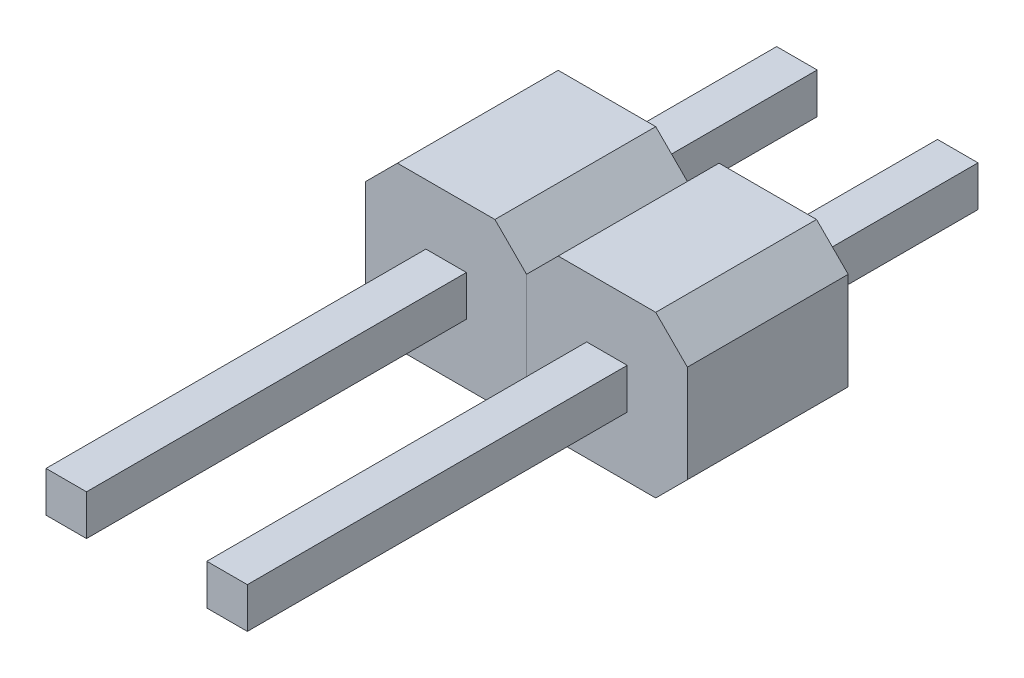
ISO-10303-21;
HEADER;
FILE_DESCRIPTION(('STEP AP214'),'2;1');
FILE_NAME('part.step','',(''),(''),'','','');
FILE_SCHEMA(('AUTOMOTIVE_DESIGN { 1 0 10303 214 1 1 1 1 }'));
ENDSEC;
DATA;
#1=APPLICATION_CONTEXT('core data for automotive mechanical design processes');
#2=APPLICATION_PROTOCOL_DEFINITION('international standard','automotive_design',2000,#1);
#3=PRODUCT_CONTEXT('',#1,'mechanical');
#4=PRODUCT('Part','Part','',(#3));
#5=PRODUCT_RELATED_PRODUCT_CATEGORY('part','',(#4));
#6=PRODUCT_DEFINITION_FORMATION('','',#4);
#7=PRODUCT_DEFINITION_CONTEXT('part definition',#1,'design');
#8=PRODUCT_DEFINITION('design','',#6,#7);
#9=PRODUCT_DEFINITION_SHAPE('','',#8);
#10=(LENGTH_UNIT() NAMED_UNIT(*) SI_UNIT(.MILLI.,.METRE.));
#11=(NAMED_UNIT(*) PLANE_ANGLE_UNIT() SI_UNIT($,.RADIAN.));
#12=(NAMED_UNIT(*) SI_UNIT($,.STERADIAN.) SOLID_ANGLE_UNIT());
#13=UNCERTAINTY_MEASURE_WITH_UNIT(LENGTH_MEASURE(1.E-05),#10,'distance_accuracy_value','');
#14=(GEOMETRIC_REPRESENTATION_CONTEXT(3) GLOBAL_UNCERTAINTY_ASSIGNED_CONTEXT((#13)) GLOBAL_UNIT_ASSIGNED_CONTEXT((#10,
#11,#12)) REPRESENTATION_CONTEXT('',''));
#15=CARTESIAN_POINT('',(0.,0.,0.));
#16=DIRECTION('',(0.,0.,1.));
#17=DIRECTION('',(1.,0.,0.));
#18=AXIS2_PLACEMENT_3D('',#15,#16,#17);
#19=CARTESIAN_POINT('',(-1.27,1.27,2.54));
#20=DIRECTION('',(0.,-1.,0.));
#21=DIRECTION('',(0.,0.,-1.));
#22=AXIS2_PLACEMENT_3D('',#19,#20,#21);
#23=PLANE('',#22);
#24=DIRECTION('',(-1.,0.,0.));
#25=VECTOR('',#24,1.);
#26=CARTESIAN_POINT('',(-1.27,1.27,2.54));
#27=LINE('',#26,#25);
#28=CARTESIAN_POINT('',(0.77,1.27,2.54));
#29=VERTEX_POINT('',#28);
#30=CARTESIAN_POINT('',(-0.77,1.27,2.54));
#31=VERTEX_POINT('',#30);
#32=EDGE_CURVE('P0_E124',#29,#31,#27,.T.);
#33=ORIENTED_EDGE('',*,*,#32,.F.);
#34=DIRECTION('',(0.,0.,-1.));
#35=VECTOR('',#34,1.);
#36=CARTESIAN_POINT('',(0.77,1.27,2.54));
#37=LINE('',#36,#35);
#38=CARTESIAN_POINT('',(0.77,1.27,0.));
#39=VERTEX_POINT('',#38);
#40=EDGE_CURVE('P0_E72',#29,#39,#37,.T.);
#41=ORIENTED_EDGE('',*,*,#40,.T.);
#42=DIRECTION('',(-1.,0.,0.));
#43=VECTOR('',#42,1.);
#44=CARTESIAN_POINT('',(-1.27,1.27,0.));
#45=LINE('',#44,#43);
#46=CARTESIAN_POINT('',(-0.77,1.27,0.));
#47=VERTEX_POINT('',#46);
#48=EDGE_CURVE('P0_E182',#39,#47,#45,.T.);
#49=ORIENTED_EDGE('',*,*,#48,.T.);
#50=DIRECTION('',(0.,0.,1.));
#51=VECTOR('',#50,1.);
#52=CARTESIAN_POINT('',(-0.77,1.27,2.54));
#53=LINE('',#52,#51);
#54=EDGE_CURVE('P0_E11',#47,#31,#53,.T.);
#55=ORIENTED_EDGE('',*,*,#54,.T.);
#56=EDGE_LOOP('',(#33,#41,#49,#55));
#57=FACE_BOUND('',#56,.T.);
#58=ADVANCED_FACE('P0_F17',(#57),#23,.F.);
#59=CARTESIAN_POINT('',(-0.77,-1.27,2.54));
#60=DIRECTION('',(0.707106781186548,0.707106781186548,0.));
#61=DIRECTION('',(0.,0.,-1.));
#62=AXIS2_PLACEMENT_3D('',#59,#60,#61);
#63=PLANE('',#62);
#64=DIRECTION('',(0.707106781186548,-0.707106781186548,0.));
#65=VECTOR('',#64,1.);
#66=CARTESIAN_POINT('',(-2.29,0.25,2.54));
#67=LINE('',#66,#65);
#68=CARTESIAN_POINT('',(-1.27,-0.77,2.54));
#69=VERTEX_POINT('',#68);
#70=CARTESIAN_POINT('',(-0.77,-1.27,2.54));
#71=VERTEX_POINT('',#70);
#72=EDGE_CURVE('P0_E80',#69,#71,#67,.T.);
#73=ORIENTED_EDGE('',*,*,#72,.F.);
#74=DIRECTION('',(0.,0.,1.));
#75=VECTOR('',#74,1.);
#76=CARTESIAN_POINT('',(-1.27,-0.77,2.54));
#77=LINE('',#76,#75);
#78=CARTESIAN_POINT('',(-1.27,-0.77,0.));
#79=VERTEX_POINT('',#78);
#80=EDGE_CURVE('P0_E40',#79,#69,#77,.T.);
#81=ORIENTED_EDGE('',*,*,#80,.F.);
#82=DIRECTION('',(-0.707106781186548,0.707106781186548,0.));
#83=VECTOR('',#82,1.);
#84=CARTESIAN_POINT('',(-0.77,-1.27,0.));
#85=LINE('',#84,#83);
#86=CARTESIAN_POINT('',(-0.77,-1.27,0.));
#87=VERTEX_POINT('',#86);
#88=EDGE_CURVE('P0_E98',#87,#79,#85,.T.);
#89=ORIENTED_EDGE('',*,*,#88,.F.);
#90=DIRECTION('',(0.,0.,-1.));
#91=VECTOR('',#90,1.);
#92=CARTESIAN_POINT('',(-0.77,-1.27,2.54));
#93=LINE('',#92,#91);
#94=EDGE_CURVE('P0_E95',#71,#87,#93,.T.);
#95=ORIENTED_EDGE('',*,*,#94,.F.);
#96=EDGE_LOOP('',(#73,#81,#89,#95));
#97=FACE_BOUND('',#96,.T.);
#98=ADVANCED_FACE('P0_F19',(#97),#63,.F.);
#99=CARTESIAN_POINT('',(-1.27,0.77,2.54));
#100=DIRECTION('',(0.707106781186548,-0.707106781186548,0.));
#101=DIRECTION('',(0.,0.,-1.));
#102=AXIS2_PLACEMENT_3D('',#99,#100,#101);
#103=PLANE('',#102);
#104=DIRECTION('',(-0.707106781186548,-0.707106781186548,0.));
#105=VECTOR('',#104,1.);
#106=CARTESIAN_POINT('',(-1.02,1.02,2.54));
#107=LINE('',#106,#105);
#108=CARTESIAN_POINT('',(-1.27,0.77,2.54));
#109=VERTEX_POINT('',#108);
#110=EDGE_CURVE('P0_E128',#31,#109,#107,.T.);
#111=ORIENTED_EDGE('',*,*,#110,.F.);
#112=ORIENTED_EDGE('',*,*,#54,.F.);
#113=DIRECTION('',(0.707106781186548,0.707106781186548,0.));
#114=VECTOR('',#113,1.);
#115=CARTESIAN_POINT('',(-1.27,0.77,0.));
#116=LINE('',#115,#114);
#117=CARTESIAN_POINT('',(-1.27,0.77,0.));
#118=VERTEX_POINT('',#117);
#119=EDGE_CURVE('P0_E190',#118,#47,#116,.T.);
#120=ORIENTED_EDGE('',*,*,#119,.F.);
#121=DIRECTION('',(0.,0.,-1.));
#122=VECTOR('',#121,1.);
#123=CARTESIAN_POINT('',(-1.27,0.77,2.54));
#124=LINE('',#123,#122);
#125=EDGE_CURVE('P0_E27',#109,#118,#124,.T.);
#126=ORIENTED_EDGE('',*,*,#125,.F.);
#127=EDGE_LOOP('',(#111,#112,#120,#126));
#128=FACE_BOUND('',#127,.T.);
#129=ADVANCED_FACE('P0_F255',(#128),#103,.F.);
#130=CARTESIAN_POINT('',(-1.27,1.27,2.54));
#131=DIRECTION('',(1.,0.,0.));
#132=DIRECTION('',(0.,1.,0.));
#133=AXIS2_PLACEMENT_3D('',#130,#131,#132);
#134=PLANE('',#133);
#135=DIRECTION('',(0.,-1.,0.));
#136=VECTOR('',#135,1.);
#137=CARTESIAN_POINT('',(-1.27,1.27,0.));
#138=LINE('',#137,#136);
#139=EDGE_CURVE('P0_E186',#118,#79,#138,.T.);
#140=ORIENTED_EDGE('',*,*,#139,.T.);
#141=ORIENTED_EDGE('',*,*,#80,.T.);
#142=DIRECTION('',(0.,-1.,0.));
#143=VECTOR('',#142,1.);
#144=CARTESIAN_POINT('',(-1.27,1.27,2.54));
#145=LINE('',#144,#143);
#146=EDGE_CURVE('P0_E89',#109,#69,#145,.T.);
#147=ORIENTED_EDGE('',*,*,#146,.F.);
#148=ORIENTED_EDGE('',*,*,#125,.T.);
#149=EDGE_LOOP('',(#140,#141,#147,#148));
#150=FACE_BOUND('',#149,.T.);
#151=ADVANCED_FACE('P0_F283',(#150),#134,.F.);
#152=CARTESIAN_POINT('',(0.77,1.27,2.54));
#153=DIRECTION('',(-0.707106781186548,-0.707106781186548,0.));
#154=DIRECTION('',(-0.707106781186548,0.707106781186548,0.));
#155=AXIS2_PLACEMENT_3D('',#152,#153,#154);
#156=PLANE('',#155);
#157=DIRECTION('',(-0.707106781186548,0.707106781186548,0.));
#158=VECTOR('',#157,1.);
#159=CARTESIAN_POINT('',(-0.25,2.29,2.54));
#160=LINE('',#159,#158);
#161=CARTESIAN_POINT('',(1.27,0.77,2.54));
#162=VERTEX_POINT('',#161);
#163=EDGE_CURVE('P0_E103',#162,#29,#160,.T.);
#164=ORIENTED_EDGE('',*,*,#163,.F.);
#165=DIRECTION('',(0.,0.,1.));
#166=VECTOR('',#165,1.);
#167=CARTESIAN_POINT('',(1.27,0.77,2.54));
#168=LINE('',#167,#166);
#169=CARTESIAN_POINT('',(1.27,0.77,0.));
#170=VERTEX_POINT('',#169);
#171=EDGE_CURVE('P0_E110',#170,#162,#168,.T.);
#172=ORIENTED_EDGE('',*,*,#171,.F.);
#173=DIRECTION('',(0.707106781186548,-0.707106781186548,0.));
#174=VECTOR('',#173,1.);
#175=CARTESIAN_POINT('',(0.77,1.27,0.));
#176=LINE('',#175,#174);
#177=EDGE_CURVE('P0_E176',#39,#170,#176,.T.);
#178=ORIENTED_EDGE('',*,*,#177,.F.);
#179=ORIENTED_EDGE('',*,*,#40,.F.);
#180=EDGE_LOOP('',(#164,#172,#178,#179));
#181=FACE_BOUND('',#180,.T.);
#182=ADVANCED_FACE('P0_F258',(#181),#156,.F.);
#183=CARTESIAN_POINT('',(-1.27,1.27,2.54));
#184=DIRECTION('',(0.,0.,1.));
#185=DIRECTION('',(1.,0.,0.));
#186=AXIS2_PLACEMENT_3D('',#183,#184,#185);
#187=PLANE('',#186);
#188=DIRECTION('',(1.,0.,0.));
#189=VECTOR('',#188,1.);
#190=CARTESIAN_POINT('',(-1.27,-1.27,2.54));
#191=LINE('',#190,#189);
#192=CARTESIAN_POINT('',(0.77,-1.27,2.54));
#193=VERTEX_POINT('',#192);
#194=EDGE_CURVE('P0_E86',#71,#193,#191,.T.);
#195=ORIENTED_EDGE('',*,*,#194,.T.);
#196=DIRECTION('',(0.707106781186548,0.707106781186548,0.));
#197=VECTOR('',#196,1.);
#198=CARTESIAN_POINT('',(1.02,-1.02,2.54));
#199=LINE('',#198,#197);
#200=CARTESIAN_POINT('',(1.27,-0.77,2.54));
#201=VERTEX_POINT('',#200);
#202=EDGE_CURVE('P0_E225',#193,#201,#199,.T.);
#203=ORIENTED_EDGE('',*,*,#202,.T.);
#204=DIRECTION('',(0.,1.,0.));
#205=VECTOR('',#204,1.);
#206=CARTESIAN_POINT('',(1.27,1.27,2.54));
#207=LINE('',#206,#205);
#208=EDGE_CURVE('P0_E117',#201,#162,#207,.T.);
#209=ORIENTED_EDGE('',*,*,#208,.T.);
#210=ORIENTED_EDGE('',*,*,#163,.T.);
#211=ORIENTED_EDGE('',*,*,#32,.T.);
#212=ORIENTED_EDGE('',*,*,#110,.T.);
#213=ORIENTED_EDGE('',*,*,#146,.T.);
#214=ORIENTED_EDGE('',*,*,#72,.T.);
#215=EDGE_LOOP('',(#195,#203,#209,#210,#211,#212,#213,#214));
#216=FACE_BOUND('',#215,.T.);
#217=ADVANCED_FACE('P0_F82',(#216),#187,.T.);
#218=CARTESIAN_POINT('',(-1.27,-1.27,2.54));
#219=DIRECTION('',(0.,1.,0.));
#220=DIRECTION('',(1.,0.,0.));
#221=AXIS2_PLACEMENT_3D('',#218,#219,#220);
#222=PLANE('',#221);
#223=DIRECTION('',(1.,0.,0.));
#224=VECTOR('',#223,1.);
#225=CARTESIAN_POINT('',(-1.27,-1.27,0.));
#226=LINE('',#225,#224);
#227=CARTESIAN_POINT('',(0.77,-1.27,0.));
#228=VERTEX_POINT('',#227);
#229=EDGE_CURVE('P0_E202',#87,#228,#226,.T.);
#230=ORIENTED_EDGE('',*,*,#229,.T.);
#231=DIRECTION('',(0.,0.,1.));
#232=VECTOR('',#231,1.);
#233=CARTESIAN_POINT('',(0.77,-1.27,2.54));
#234=LINE('',#233,#232);
#235=EDGE_CURVE('P0_E107',#228,#193,#234,.T.);
#236=ORIENTED_EDGE('',*,*,#235,.T.);
#237=ORIENTED_EDGE('',*,*,#194,.F.);
#238=ORIENTED_EDGE('',*,*,#94,.T.);
#239=EDGE_LOOP('',(#230,#236,#237,#238));
#240=FACE_BOUND('',#239,.T.);
#241=ADVANCED_FACE('P0_F105',(#240),#222,.F.);
#242=CARTESIAN_POINT('',(1.27,1.27,2.54));
#243=DIRECTION('',(-1.,0.,0.));
#244=DIRECTION('',(0.,1.,0.));
#245=AXIS2_PLACEMENT_3D('',#242,#243,#244);
#246=PLANE('',#245);
#247=ORIENTED_EDGE('',*,*,#208,.F.);
#248=DIRECTION('',(0.,0.,-1.));
#249=VECTOR('',#248,1.);
#250=CARTESIAN_POINT('',(1.27,-0.77,2.54));
#251=LINE('',#250,#249);
#252=CARTESIAN_POINT('',(1.27,-0.77,0.));
#253=VERTEX_POINT('',#252);
#254=EDGE_CURVE('P0_E211',#201,#253,#251,.T.);
#255=ORIENTED_EDGE('',*,*,#254,.T.);
#256=DIRECTION('',(0.,1.,0.));
#257=VECTOR('',#256,1.);
#258=CARTESIAN_POINT('',(1.27,1.27,0.));
#259=LINE('',#258,#257);
#260=EDGE_CURVE('P0_E206',#253,#170,#259,.T.);
#261=ORIENTED_EDGE('',*,*,#260,.T.);
#262=ORIENTED_EDGE('',*,*,#171,.T.);
#263=EDGE_LOOP('',(#247,#255,#261,#262));
#264=FACE_BOUND('',#263,.T.);
#265=ADVANCED_FACE('P0_F261',(#264),#246,.F.);
#266=CARTESIAN_POINT('',(-1.27,1.27,0.));
#267=DIRECTION('',(0.,0.,1.));
#268=DIRECTION('',(1.,0.,0.));
#269=AXIS2_PLACEMENT_3D('',#266,#267,#268);
#270=PLANE('',#269);
#271=ORIENTED_EDGE('',*,*,#260,.F.);
#272=DIRECTION('',(-0.707106781186548,-0.707106781186548,0.));
#273=VECTOR('',#272,1.);
#274=CARTESIAN_POINT('',(1.27,-0.77,0.));
#275=LINE('',#274,#273);
#276=EDGE_CURVE('P0_E215',#253,#228,#275,.T.);
#277=ORIENTED_EDGE('',*,*,#276,.T.);
#278=ORIENTED_EDGE('',*,*,#229,.F.);
#279=ORIENTED_EDGE('',*,*,#88,.T.);
#280=ORIENTED_EDGE('',*,*,#139,.F.);
#281=ORIENTED_EDGE('',*,*,#119,.T.);
#282=ORIENTED_EDGE('',*,*,#48,.F.);
#283=ORIENTED_EDGE('',*,*,#177,.T.);
#284=EDGE_LOOP('',(#271,#277,#278,#279,#280,#281,#282,#283));
#285=FACE_BOUND('',#284,.T.);
#286=ADVANCED_FACE('P0_F253',(#285),#270,.F.);
#287=CARTESIAN_POINT('',(1.27,-0.77,2.54));
#288=DIRECTION('',(-0.707106781186548,0.707106781186548,0.));
#289=DIRECTION('',(0.,0.,1.));
#290=AXIS2_PLACEMENT_3D('',#287,#288,#289);
#291=PLANE('',#290);
#292=ORIENTED_EDGE('',*,*,#202,.F.);
#293=ORIENTED_EDGE('',*,*,#235,.F.);
#294=ORIENTED_EDGE('',*,*,#276,.F.);
#295=ORIENTED_EDGE('',*,*,#254,.F.);
#296=EDGE_LOOP('',(#292,#293,#294,#295));
#297=FACE_BOUND('',#296,.T.);
#298=ADVANCED_FACE('P0_F302',(#297),#291,.F.);
#299=CLOSED_SHELL('',(#58,#98,#129,#151,#182,#217,#241,#265,#286,#298));
#300=MANIFOLD_SOLID_BREP('P0_B1',#299);
#301=CARTESIAN_POINT('',(0.32,0.32,8.54));
#302=DIRECTION('',(1.,0.,0.));
#303=DIRECTION('',(0.,-1.,0.));
#304=AXIS2_PLACEMENT_3D('',#301,#302,#303);
#305=PLANE('',#304);
#306=DIRECTION('',(0.,-1.,0.));
#307=VECTOR('',#306,1.);
#308=CARTESIAN_POINT('',(0.32,0.32,-3.));
#309=LINE('',#308,#307);
#310=CARTESIAN_POINT('',(0.32,0.32,-3.));
#311=VERTEX_POINT('',#310);
#312=CARTESIAN_POINT('',(0.32,-0.32,-3.));
#313=VERTEX_POINT('',#312);
#314=EDGE_CURVE('P1_E11',#311,#313,#309,.T.);
#315=ORIENTED_EDGE('',*,*,#314,.F.);
#316=DIRECTION('',(0.,0.,-1.));
#317=VECTOR('',#316,1.);
#318=CARTESIAN_POINT('',(0.32,0.32,8.54));
#319=LINE('',#318,#317);
#320=CARTESIAN_POINT('',(0.32,0.32,8.54));
#321=VERTEX_POINT('',#320);
#322=EDGE_CURVE('P1_E71',#321,#311,#319,.T.);
#323=ORIENTED_EDGE('',*,*,#322,.F.);
#324=DIRECTION('',(0.,-1.,0.));
#325=VECTOR('',#324,1.);
#326=CARTESIAN_POINT('',(0.32,0.32,8.54));
#327=LINE('',#326,#325);
#328=CARTESIAN_POINT('',(0.32,-0.32,8.54));
#329=VERTEX_POINT('',#328);
#330=EDGE_CURVE('P1_E25',#321,#329,#327,.T.);
#331=ORIENTED_EDGE('',*,*,#330,.T.);
#332=DIRECTION('',(0.,0.,-1.));
#333=VECTOR('',#332,1.);
#334=CARTESIAN_POINT('',(0.32,-0.32,8.54));
#335=LINE('',#334,#333);
#336=EDGE_CURVE('P1_E99',#329,#313,#335,.T.);
#337=ORIENTED_EDGE('',*,*,#336,.T.);
#338=EDGE_LOOP('',(#315,#323,#331,#337));
#339=FACE_BOUND('',#338,.T.);
#340=ADVANCED_FACE('P1_F17',(#339),#305,.T.);
#341=CARTESIAN_POINT('',(-0.32,0.32,-3.));
#342=DIRECTION('',(0.,0.,1.));
#343=DIRECTION('',(1.,0.,0.));
#344=AXIS2_PLACEMENT_3D('',#341,#342,#343);
#345=PLANE('',#344);
#346=DIRECTION('',(0.,1.,0.));
#347=VECTOR('',#346,1.);
#348=CARTESIAN_POINT('',(-0.32,0.32,-3.));
#349=LINE('',#348,#347);
#350=CARTESIAN_POINT('',(-0.32,-0.32,-3.));
#351=VERTEX_POINT('',#350);
#352=CARTESIAN_POINT('',(-0.32,0.32,-3.));
#353=VERTEX_POINT('',#352);
#354=EDGE_CURVE('P1_E94',#351,#353,#349,.T.);
#355=ORIENTED_EDGE('',*,*,#354,.T.);
#356=DIRECTION('',(1.,0.,0.));
#357=VECTOR('',#356,1.);
#358=CARTESIAN_POINT('',(-0.32,0.32,-3.));
#359=LINE('',#358,#357);
#360=EDGE_CURVE('P1_E72',#353,#311,#359,.T.);
#361=ORIENTED_EDGE('',*,*,#360,.T.);
#362=ORIENTED_EDGE('',*,*,#314,.T.);
#363=DIRECTION('',(-1.,0.,0.));
#364=VECTOR('',#363,1.);
#365=CARTESIAN_POINT('',(-0.32,-0.32,-3.));
#366=LINE('',#365,#364);
#367=EDGE_CURVE('P1_E83',#313,#351,#366,.T.);
#368=ORIENTED_EDGE('',*,*,#367,.T.);
#369=EDGE_LOOP('',(#355,#361,#362,#368));
#370=FACE_BOUND('',#369,.T.);
#371=ADVANCED_FACE('P1_F117',(#370),#345,.F.);
#372=CARTESIAN_POINT('',(-0.32,0.32,8.54));
#373=DIRECTION('',(0.,0.,1.));
#374=DIRECTION('',(1.,0.,0.));
#375=AXIS2_PLACEMENT_3D('',#372,#373,#374);
#376=PLANE('',#375);
#377=DIRECTION('',(0.,1.,0.));
#378=VECTOR('',#377,1.);
#379=CARTESIAN_POINT('',(-0.32,0.32,8.54));
#380=LINE('',#379,#378);
#381=CARTESIAN_POINT('',(-0.32,-0.32,8.54));
#382=VERTEX_POINT('',#381);
#383=CARTESIAN_POINT('',(-0.32,0.32,8.54));
#384=VERTEX_POINT('',#383);
#385=EDGE_CURVE('P1_E67',#382,#384,#380,.T.);
#386=ORIENTED_EDGE('',*,*,#385,.F.);
#387=DIRECTION('',(-1.,0.,0.));
#388=VECTOR('',#387,1.);
#389=CARTESIAN_POINT('',(-0.32,-0.32,8.54));
#390=LINE('',#389,#388);
#391=EDGE_CURVE('P1_E102',#329,#382,#390,.T.);
#392=ORIENTED_EDGE('',*,*,#391,.F.);
#393=ORIENTED_EDGE('',*,*,#330,.F.);
#394=DIRECTION('',(1.,0.,0.));
#395=VECTOR('',#394,1.);
#396=CARTESIAN_POINT('',(-0.32,0.32,8.54));
#397=LINE('',#396,#395);
#398=EDGE_CURVE('P1_E63',#384,#321,#397,.T.);
#399=ORIENTED_EDGE('',*,*,#398,.F.);
#400=EDGE_LOOP('',(#386,#392,#393,#399));
#401=FACE_BOUND('',#400,.T.);
#402=ADVANCED_FACE('P1_F65',(#401),#376,.T.);
#403=CARTESIAN_POINT('',(-0.32,0.32,8.54));
#404=DIRECTION('',(0.,1.,0.));
#405=DIRECTION('',(1.,0.,0.));
#406=AXIS2_PLACEMENT_3D('',#403,#404,#405);
#407=PLANE('',#406);
#408=ORIENTED_EDGE('',*,*,#360,.F.);
#409=DIRECTION('',(0.,0.,-1.));
#410=VECTOR('',#409,1.);
#411=CARTESIAN_POINT('',(-0.32,0.32,8.54));
#412=LINE('',#411,#410);
#413=EDGE_CURVE('P1_E76',#384,#353,#412,.T.);
#414=ORIENTED_EDGE('',*,*,#413,.F.);
#415=ORIENTED_EDGE('',*,*,#398,.T.);
#416=ORIENTED_EDGE('',*,*,#322,.T.);
#417=EDGE_LOOP('',(#408,#414,#415,#416));
#418=FACE_BOUND('',#417,.T.);
#419=ADVANCED_FACE('P1_F77',(#418),#407,.T.);
#420=CARTESIAN_POINT('',(-0.32,-0.32,8.54));
#421=DIRECTION('',(0.,-1.,0.));
#422=DIRECTION('',(-1.,0.,0.));
#423=AXIS2_PLACEMENT_3D('',#420,#421,#422);
#424=PLANE('',#423);
#425=ORIENTED_EDGE('',*,*,#367,.F.);
#426=ORIENTED_EDGE('',*,*,#336,.F.);
#427=ORIENTED_EDGE('',*,*,#391,.T.);
#428=DIRECTION('',(0.,0.,-1.));
#429=VECTOR('',#428,1.);
#430=CARTESIAN_POINT('',(-0.32,-0.32,8.54));
#431=LINE('',#430,#429);
#432=EDGE_CURVE('P1_E87',#382,#351,#431,.T.);
#433=ORIENTED_EDGE('',*,*,#432,.T.);
#434=EDGE_LOOP('',(#425,#426,#427,#433));
#435=FACE_BOUND('',#434,.T.);
#436=ADVANCED_FACE('P1_F150',(#435),#424,.T.);
#437=CARTESIAN_POINT('',(-0.32,0.32,8.54));
#438=DIRECTION('',(-1.,0.,0.));
#439=DIRECTION('',(0.,0.,1.));
#440=AXIS2_PLACEMENT_3D('',#437,#438,#439);
#441=PLANE('',#440);
#442=ORIENTED_EDGE('',*,*,#354,.F.);
#443=ORIENTED_EDGE('',*,*,#432,.F.);
#444=ORIENTED_EDGE('',*,*,#385,.T.);
#445=ORIENTED_EDGE('',*,*,#413,.T.);
#446=EDGE_LOOP('',(#442,#443,#444,#445));
#447=FACE_BOUND('',#446,.T.);
#448=ADVANCED_FACE('P1_F85',(#447),#441,.T.);
#449=CLOSED_SHELL('',(#340,#371,#402,#419,#436,#448));
#450=MANIFOLD_SOLID_BREP('P1_B1',#449);
#451=CARTESIAN_POINT('',(2.22,0.32,8.54));
#452=DIRECTION('',(0.,1.,0.));
#453=DIRECTION('',(1.,0.,0.));
#454=AXIS2_PLACEMENT_3D('',#451,#452,#453);
#455=PLANE('',#454);
#456=DIRECTION('',(1.,0.,0.));
#457=VECTOR('',#456,1.);
#458=CARTESIAN_POINT('',(2.22,0.32,-3.));
#459=LINE('',#458,#457);
#460=CARTESIAN_POINT('',(2.22,0.32,-3.));
#461=VERTEX_POINT('',#460);
#462=CARTESIAN_POINT('',(2.86,0.32,-3.));
#463=VERTEX_POINT('',#462);
#464=EDGE_CURVE('P2_E20',#461,#463,#459,.T.);
#465=ORIENTED_EDGE('',*,*,#464,.F.);
#466=DIRECTION('',(0.,0.,-1.));
#467=VECTOR('',#466,1.);
#468=CARTESIAN_POINT('',(2.22,0.32,8.54));
#469=LINE('',#468,#467);
#470=CARTESIAN_POINT('',(2.22,0.32,8.54));
#471=VERTEX_POINT('',#470);
#472=EDGE_CURVE('P2_E108',#471,#461,#469,.T.);
#473=ORIENTED_EDGE('',*,*,#472,.F.);
#474=DIRECTION('',(1.,0.,0.));
#475=VECTOR('',#474,1.);
#476=CARTESIAN_POINT('',(2.22,0.32,8.54));
#477=LINE('',#476,#475);
#478=CARTESIAN_POINT('',(2.86,0.32,8.54));
#479=VERTEX_POINT('',#478);
#480=EDGE_CURVE('P2_E113',#471,#479,#477,.T.);
#481=ORIENTED_EDGE('',*,*,#480,.T.);
#482=DIRECTION('',(0.,0.,-1.));
#483=VECTOR('',#482,1.);
#484=CARTESIAN_POINT('',(2.86,0.32,8.54));
#485=LINE('',#484,#483);
#486=EDGE_CURVE('P2_E11',#479,#463,#485,.T.);
#487=ORIENTED_EDGE('',*,*,#486,.T.);
#488=EDGE_LOOP('',(#465,#473,#481,#487));
#489=FACE_BOUND('',#488,.T.);
#490=ADVANCED_FACE('P2_F17',(#489),#455,.T.);
#491=CARTESIAN_POINT('',(2.86,0.32,8.54));
#492=DIRECTION('',(1.,0.,0.));
#493=DIRECTION('',(0.,-1.,0.));
#494=AXIS2_PLACEMENT_3D('',#491,#492,#493);
#495=PLANE('',#494);
#496=DIRECTION('',(0.,-1.,0.));
#497=VECTOR('',#496,1.);
#498=CARTESIAN_POINT('',(2.86,0.32,-3.));
#499=LINE('',#498,#497);
#500=CARTESIAN_POINT('',(2.86,-0.32,-3.));
#501=VERTEX_POINT('',#500);
#502=EDGE_CURVE('P2_E26',#463,#501,#499,.T.);
#503=ORIENTED_EDGE('',*,*,#502,.F.);
#504=ORIENTED_EDGE('',*,*,#486,.F.);
#505=DIRECTION('',(0.,-1.,0.));
#506=VECTOR('',#505,1.);
#507=CARTESIAN_POINT('',(2.86,0.32,8.54));
#508=LINE('',#507,#506);
#509=CARTESIAN_POINT('',(2.86,-0.32,8.54));
#510=VERTEX_POINT('',#509);
#511=EDGE_CURVE('P2_E80',#479,#510,#508,.T.);
#512=ORIENTED_EDGE('',*,*,#511,.T.);
#513=DIRECTION('',(0.,0.,-1.));
#514=VECTOR('',#513,1.);
#515=CARTESIAN_POINT('',(2.86,-0.32,8.54));
#516=LINE('',#515,#514);
#517=EDGE_CURVE('P2_E77',#510,#501,#516,.T.);
#518=ORIENTED_EDGE('',*,*,#517,.T.);
#519=EDGE_LOOP('',(#503,#504,#512,#518));
#520=FACE_BOUND('',#519,.T.);
#521=ADVANCED_FACE('P2_F78',(#520),#495,.T.);
#522=CARTESIAN_POINT('',(2.22,0.32,-3.));
#523=DIRECTION('',(0.,0.,1.));
#524=DIRECTION('',(1.,0.,0.));
#525=AXIS2_PLACEMENT_3D('',#522,#523,#524);
#526=PLANE('',#525);
#527=DIRECTION('',(0.,1.,0.));
#528=VECTOR('',#527,1.);
#529=CARTESIAN_POINT('',(2.22,0.32,-3.));
#530=LINE('',#529,#528);
#531=CARTESIAN_POINT('',(2.22,-0.32,-3.));
#532=VERTEX_POINT('',#531);
#533=EDGE_CURVE('P2_E101',#532,#461,#530,.T.);
#534=ORIENTED_EDGE('',*,*,#533,.T.);
#535=ORIENTED_EDGE('',*,*,#464,.T.);
#536=ORIENTED_EDGE('',*,*,#502,.T.);
#537=DIRECTION('',(-1.,0.,0.));
#538=VECTOR('',#537,1.);
#539=CARTESIAN_POINT('',(2.22,-0.32,-3.));
#540=LINE('',#539,#538);
#541=EDGE_CURVE('P2_E73',#501,#532,#540,.T.);
#542=ORIENTED_EDGE('',*,*,#541,.T.);
#543=EDGE_LOOP('',(#534,#535,#536,#542));
#544=FACE_BOUND('',#543,.T.);
#545=ADVANCED_FACE('P2_F71',(#544),#526,.F.);
#546=CARTESIAN_POINT('',(2.22,0.32,8.54));
#547=DIRECTION('',(0.,0.,1.));
#548=DIRECTION('',(1.,0.,0.));
#549=AXIS2_PLACEMENT_3D('',#546,#547,#548);
#550=PLANE('',#549);
#551=DIRECTION('',(0.,1.,0.));
#552=VECTOR('',#551,1.);
#553=CARTESIAN_POINT('',(2.22,0.32,8.54));
#554=LINE('',#553,#552);
#555=CARTESIAN_POINT('',(2.22,-0.32,8.54));
#556=VERTEX_POINT('',#555);
#557=EDGE_CURVE('P2_E104',#556,#471,#554,.T.);
#558=ORIENTED_EDGE('',*,*,#557,.F.);
#559=DIRECTION('',(-1.,0.,0.));
#560=VECTOR('',#559,1.);
#561=CARTESIAN_POINT('',(2.22,-0.32,8.54));
#562=LINE('',#561,#560);
#563=EDGE_CURVE('P2_E85',#510,#556,#562,.T.);
#564=ORIENTED_EDGE('',*,*,#563,.F.);
#565=ORIENTED_EDGE('',*,*,#511,.F.);
#566=ORIENTED_EDGE('',*,*,#480,.F.);
#567=EDGE_LOOP('',(#558,#564,#565,#566));
#568=FACE_BOUND('',#567,.T.);
#569=ADVANCED_FACE('P2_F149',(#568),#550,.T.);
#570=CARTESIAN_POINT('',(2.22,0.32,8.54));
#571=DIRECTION('',(-1.,0.,0.));
#572=DIRECTION('',(0.,0.,1.));
#573=AXIS2_PLACEMENT_3D('',#570,#571,#572);
#574=PLANE('',#573);
#575=ORIENTED_EDGE('',*,*,#533,.F.);
#576=DIRECTION('',(0.,0.,-1.));
#577=VECTOR('',#576,1.);
#578=CARTESIAN_POINT('',(2.22,-0.32,8.54));
#579=LINE('',#578,#577);
#580=EDGE_CURVE('P2_E90',#556,#532,#579,.T.);
#581=ORIENTED_EDGE('',*,*,#580,.F.);
#582=ORIENTED_EDGE('',*,*,#557,.T.);
#583=ORIENTED_EDGE('',*,*,#472,.T.);
#584=EDGE_LOOP('',(#575,#581,#582,#583));
#585=FACE_BOUND('',#584,.T.);
#586=ADVANCED_FACE('P2_F138',(#585),#574,.T.);
#587=CARTESIAN_POINT('',(2.22,-0.32,8.54));
#588=DIRECTION('',(0.,-1.,0.));
#589=DIRECTION('',(-1.,0.,0.));
#590=AXIS2_PLACEMENT_3D('',#587,#588,#589);
#591=PLANE('',#590);
#592=ORIENTED_EDGE('',*,*,#541,.F.);
#593=ORIENTED_EDGE('',*,*,#517,.F.);
#594=ORIENTED_EDGE('',*,*,#563,.T.);
#595=ORIENTED_EDGE('',*,*,#580,.T.);
#596=EDGE_LOOP('',(#592,#593,#594,#595));
#597=FACE_BOUND('',#596,.T.);
#598=ADVANCED_FACE('P2_F88',(#597),#591,.T.);
#599=CLOSED_SHELL('',(#490,#521,#545,#569,#586,#598));
#600=MANIFOLD_SOLID_BREP('P2_B1',#599);
#601=CARTESIAN_POINT('',(3.81,-0.77,2.54));
#602=DIRECTION('',(-0.707106781186548,0.707106781186548,0.));
#603=DIRECTION('',(0.,0.,1.));
#604=AXIS2_PLACEMENT_3D('',#601,#602,#603);
#605=PLANE('',#604);
#606=DIRECTION('',(0.707106781186548,0.707106781186548,0.));
#607=VECTOR('',#606,1.);
#608=CARTESIAN_POINT('',(3.56,-1.02,2.54));
#609=LINE('',#608,#607);
#610=CARTESIAN_POINT('',(3.31,-1.27,2.54));
#611=VERTEX_POINT('',#610);
#612=CARTESIAN_POINT('',(3.81,-0.77,2.54));
#613=VERTEX_POINT('',#612);
#614=EDGE_CURVE('P3_E146',#611,#613,#609,.T.);
#615=ORIENTED_EDGE('',*,*,#614,.F.);
#616=DIRECTION('',(0.,0.,1.));
#617=VECTOR('',#616,1.);
#618=CARTESIAN_POINT('',(3.31,-1.27,2.54));
#619=LINE('',#618,#617);
#620=CARTESIAN_POINT('',(3.31,-1.27,0.));
#621=VERTEX_POINT('',#620);
#622=EDGE_CURVE('P3_E50',#621,#611,#619,.T.);
#623=ORIENTED_EDGE('',*,*,#622,.F.);
#624=DIRECTION('',(-0.707106781186548,-0.707106781186548,0.));
#625=VECTOR('',#624,1.);
#626=CARTESIAN_POINT('',(3.81,-0.77,0.));
#627=LINE('',#626,#625);
#628=CARTESIAN_POINT('',(3.81,-0.77,0.));
#629=VERTEX_POINT('',#628);
#630=EDGE_CURVE('P3_E107',#629,#621,#627,.T.);
#631=ORIENTED_EDGE('',*,*,#630,.F.);
#632=DIRECTION('',(0.,0.,-1.));
#633=VECTOR('',#632,1.);
#634=CARTESIAN_POINT('',(3.81,-0.77,2.54));
#635=LINE('',#634,#633);
#636=EDGE_CURVE('P3_E11',#613,#629,#635,.T.);
#637=ORIENTED_EDGE('',*,*,#636,.F.);
#638=EDGE_LOOP('',(#615,#623,#631,#637));
#639=FACE_BOUND('',#638,.T.);
#640=ADVANCED_FACE('P3_F17',(#639),#605,.F.);
#641=CARTESIAN_POINT('',(3.81,1.27,2.54));
#642=DIRECTION('',(-1.,0.,0.));
#643=DIRECTION('',(0.,1.,0.));
#644=AXIS2_PLACEMENT_3D('',#641,#642,#643);
#645=PLANE('',#644);
#646=DIRECTION('',(0.,1.,0.));
#647=VECTOR('',#646,1.);
#648=CARTESIAN_POINT('',(3.81,1.27,2.54));
#649=LINE('',#648,#647);
#650=CARTESIAN_POINT('',(3.81,0.77,2.54));
#651=VERTEX_POINT('',#650);
#652=EDGE_CURVE('P3_E104',#613,#651,#649,.T.);
#653=ORIENTED_EDGE('',*,*,#652,.F.);
#654=ORIENTED_EDGE('',*,*,#636,.T.);
#655=DIRECTION('',(0.,1.,0.));
#656=VECTOR('',#655,1.);
#657=CARTESIAN_POINT('',(3.81,1.27,0.));
#658=LINE('',#657,#656);
#659=CARTESIAN_POINT('',(3.81,0.77,0.));
#660=VERTEX_POINT('',#659);
#661=EDGE_CURVE('P3_E102',#629,#660,#658,.T.);
#662=ORIENTED_EDGE('',*,*,#661,.T.);
#663=DIRECTION('',(0.,0.,1.));
#664=VECTOR('',#663,1.);
#665=CARTESIAN_POINT('',(3.81,0.77,2.54));
#666=LINE('',#665,#664);
#667=EDGE_CURVE('P3_E170',#660,#651,#666,.T.);
#668=ORIENTED_EDGE('',*,*,#667,.T.);
#669=EDGE_LOOP('',(#653,#654,#662,#668));
#670=FACE_BOUND('',#669,.T.);
#671=ADVANCED_FACE('P3_F19',(#670),#645,.F.);
#672=CARTESIAN_POINT('',(1.77,-1.27,2.54));
#673=DIRECTION('',(0.707106781186548,0.707106781186548,0.));
#674=DIRECTION('',(0.,0.,-1.));
#675=AXIS2_PLACEMENT_3D('',#672,#673,#674);
#676=PLANE('',#675);
#677=DIRECTION('',(0.707106781186548,-0.707106781186548,0.));
#678=VECTOR('',#677,1.);
#679=CARTESIAN_POINT('',(0.25,0.25,2.54));
#680=LINE('',#679,#678);
#681=CARTESIAN_POINT('',(1.27,-0.77,2.54));
#682=VERTEX_POINT('',#681);
#683=CARTESIAN_POINT('',(1.77,-1.27,2.54));
#684=VERTEX_POINT('',#683);
#685=EDGE_CURVE('P3_E156',#682,#684,#680,.T.);
#686=ORIENTED_EDGE('',*,*,#685,.F.);
#687=DIRECTION('',(0.,0.,1.));
#688=VECTOR('',#687,1.);
#689=CARTESIAN_POINT('',(1.27,-0.77,2.54));
#690=LINE('',#689,#688);
#691=CARTESIAN_POINT('',(1.27,-0.77,0.));
#692=VERTEX_POINT('',#691);
#693=EDGE_CURVE('P3_E118',#692,#682,#690,.T.);
#694=ORIENTED_EDGE('',*,*,#693,.F.);
#695=DIRECTION('',(-0.707106781186548,0.707106781186548,0.));
#696=VECTOR('',#695,1.);
#697=CARTESIAN_POINT('',(1.77,-1.27,0.));
#698=LINE('',#697,#696);
#699=CARTESIAN_POINT('',(1.77,-1.27,0.));
#700=VERTEX_POINT('',#699);
#701=EDGE_CURVE('P3_E163',#700,#692,#698,.T.);
#702=ORIENTED_EDGE('',*,*,#701,.F.);
#703=DIRECTION('',(0.,0.,-1.));
#704=VECTOR('',#703,1.);
#705=CARTESIAN_POINT('',(1.77,-1.27,2.54));
#706=LINE('',#705,#704);
#707=EDGE_CURVE('P3_E26',#684,#700,#706,.T.);
#708=ORIENTED_EDGE('',*,*,#707,.F.);
#709=EDGE_LOOP('',(#686,#694,#702,#708));
#710=FACE_BOUND('',#709,.T.);
#711=ADVANCED_FACE('P3_F272',(#710),#676,.F.);
#712=CARTESIAN_POINT('',(1.27,-1.27,2.54));
#713=DIRECTION('',(0.,1.,0.));
#714=DIRECTION('',(1.,0.,0.));
#715=AXIS2_PLACEMENT_3D('',#712,#713,#714);
#716=PLANE('',#715);
#717=DIRECTION('',(1.,0.,0.));
#718=VECTOR('',#717,1.);
#719=CARTESIAN_POINT('',(1.27,-1.27,0.));
#720=LINE('',#719,#718);
#721=EDGE_CURVE('P3_E111',#700,#621,#720,.T.);
#722=ORIENTED_EDGE('',*,*,#721,.T.);
#723=ORIENTED_EDGE('',*,*,#622,.T.);
#724=DIRECTION('',(1.,0.,0.));
#725=VECTOR('',#724,1.);
#726=CARTESIAN_POINT('',(1.27,-1.27,2.54));
#727=LINE('',#726,#725);
#728=EDGE_CURVE('P3_E142',#684,#611,#727,.T.);
#729=ORIENTED_EDGE('',*,*,#728,.F.);
#730=ORIENTED_EDGE('',*,*,#707,.T.);
#731=EDGE_LOOP('',(#722,#723,#729,#730));
#732=FACE_BOUND('',#731,.T.);
#733=ADVANCED_FACE('P3_F267',(#732),#716,.F.);
#734=CARTESIAN_POINT('',(3.31,1.27,2.54));
#735=DIRECTION('',(-0.707106781186548,-0.707106781186548,0.));
#736=DIRECTION('',(-0.707106781186548,0.707106781186548,0.));
#737=AXIS2_PLACEMENT_3D('',#734,#735,#736);
#738=PLANE('',#737);
#739=DIRECTION('',(-0.707106781186548,0.707106781186548,0.));
#740=VECTOR('',#739,1.);
#741=CARTESIAN_POINT('',(2.29,2.29,2.54));
#742=LINE('',#741,#740);
#743=CARTESIAN_POINT('',(3.31,1.27,2.54));
#744=VERTEX_POINT('',#743);
#745=EDGE_CURVE('P3_E149',#651,#744,#742,.T.);
#746=ORIENTED_EDGE('',*,*,#745,.F.);
#747=ORIENTED_EDGE('',*,*,#667,.F.);
#748=DIRECTION('',(0.707106781186548,-0.707106781186548,0.));
#749=VECTOR('',#748,1.);
#750=CARTESIAN_POINT('',(3.31,1.27,0.));
#751=LINE('',#750,#749);
#752=CARTESIAN_POINT('',(3.31,1.27,0.));
#753=VERTEX_POINT('',#752);
#754=EDGE_CURVE('P3_E116',#753,#660,#751,.T.);
#755=ORIENTED_EDGE('',*,*,#754,.F.);
#756=DIRECTION('',(0.,0.,-1.));
#757=VECTOR('',#756,1.);
#758=CARTESIAN_POINT('',(3.31,1.27,2.54));
#759=LINE('',#758,#757);
#760=EDGE_CURVE('P3_E134',#744,#753,#759,.T.);
#761=ORIENTED_EDGE('',*,*,#760,.F.);
#762=EDGE_LOOP('',(#746,#747,#755,#761));
#763=FACE_BOUND('',#762,.T.);
#764=ADVANCED_FACE('P3_F287',(#763),#738,.F.);
#765=CARTESIAN_POINT('',(1.27,1.27,0.));
#766=DIRECTION('',(0.,0.,1.));
#767=DIRECTION('',(1.,0.,0.));
#768=AXIS2_PLACEMENT_3D('',#765,#766,#767);
#769=PLANE('',#768);
#770=ORIENTED_EDGE('',*,*,#661,.F.);
#771=ORIENTED_EDGE('',*,*,#630,.T.);
#772=ORIENTED_EDGE('',*,*,#721,.F.);
#773=ORIENTED_EDGE('',*,*,#701,.T.);
#774=DIRECTION('',(0.,-1.,0.));
#775=VECTOR('',#774,1.);
#776=CARTESIAN_POINT('',(1.27,1.27,0.));
#777=LINE('',#776,#775);
#778=CARTESIAN_POINT('',(1.27,0.77,0.));
#779=VERTEX_POINT('',#778);
#780=EDGE_CURVE('P3_E124',#779,#692,#777,.T.);
#781=ORIENTED_EDGE('',*,*,#780,.F.);
#782=DIRECTION('',(0.707106781186548,0.707106781186548,0.));
#783=VECTOR('',#782,1.);
#784=CARTESIAN_POINT('',(1.27,0.77,0.));
#785=LINE('',#784,#783);
#786=CARTESIAN_POINT('',(1.77,1.27,0.));
#787=VERTEX_POINT('',#786);
#788=EDGE_CURVE('P3_E128',#779,#787,#785,.T.);
#789=ORIENTED_EDGE('',*,*,#788,.T.);
#790=DIRECTION('',(-1.,0.,0.));
#791=VECTOR('',#790,1.);
#792=CARTESIAN_POINT('',(1.27,1.27,0.));
#793=LINE('',#792,#791);
#794=EDGE_CURVE('P3_E138',#753,#787,#793,.T.);
#795=ORIENTED_EDGE('',*,*,#794,.F.);
#796=ORIENTED_EDGE('',*,*,#754,.T.);
#797=EDGE_LOOP('',(#770,#771,#772,#773,#781,#789,#795,#796));
#798=FACE_BOUND('',#797,.T.);
#799=ADVANCED_FACE('P3_F114',(#798),#769,.F.);
#800=CARTESIAN_POINT('',(1.27,1.27,2.54));
#801=DIRECTION('',(1.,0.,0.));
#802=DIRECTION('',(0.,1.,0.));
#803=AXIS2_PLACEMENT_3D('',#800,#801,#802);
#804=PLANE('',#803);
#805=ORIENTED_EDGE('',*,*,#780,.T.);
#806=ORIENTED_EDGE('',*,*,#693,.T.);
#807=DIRECTION('',(0.,-1.,0.));
#808=VECTOR('',#807,1.);
#809=CARTESIAN_POINT('',(1.27,1.27,2.54));
#810=LINE('',#809,#808);
#811=CARTESIAN_POINT('',(1.27,0.77,2.54));
#812=VERTEX_POINT('',#811);
#813=EDGE_CURVE('P3_E152',#812,#682,#810,.T.);
#814=ORIENTED_EDGE('',*,*,#813,.F.);
#815=DIRECTION('',(0.,0.,-1.));
#816=VECTOR('',#815,1.);
#817=CARTESIAN_POINT('',(1.27,0.77,2.54));
#818=LINE('',#817,#816);
#819=EDGE_CURVE('P3_E135',#812,#779,#818,.T.);
#820=ORIENTED_EDGE('',*,*,#819,.T.);
#821=EDGE_LOOP('',(#805,#806,#814,#820));
#822=FACE_BOUND('',#821,.T.);
#823=ADVANCED_FACE('P3_F278',(#822),#804,.F.);
#824=CARTESIAN_POINT('',(1.27,1.27,2.54));
#825=DIRECTION('',(0.,0.,1.));
#826=DIRECTION('',(1.,0.,0.));
#827=AXIS2_PLACEMENT_3D('',#824,#825,#826);
#828=PLANE('',#827);
#829=ORIENTED_EDGE('',*,*,#728,.T.);
#830=ORIENTED_EDGE('',*,*,#614,.T.);
#831=ORIENTED_EDGE('',*,*,#652,.T.);
#832=ORIENTED_EDGE('',*,*,#745,.T.);
#833=DIRECTION('',(-1.,0.,0.));
#834=VECTOR('',#833,1.);
#835=CARTESIAN_POINT('',(1.27,1.27,2.54));
#836=LINE('',#835,#834);
#837=CARTESIAN_POINT('',(1.77,1.27,2.54));
#838=VERTEX_POINT('',#837);
#839=EDGE_CURVE('P3_E130',#744,#838,#836,.T.);
#840=ORIENTED_EDGE('',*,*,#839,.T.);
#841=DIRECTION('',(-0.707106781186548,-0.707106781186548,0.));
#842=VECTOR('',#841,1.);
#843=CARTESIAN_POINT('',(1.52,1.02,2.54));
#844=LINE('',#843,#842);
#845=EDGE_CURVE('P3_E246',#838,#812,#844,.T.);
#846=ORIENTED_EDGE('',*,*,#845,.T.);
#847=ORIENTED_EDGE('',*,*,#813,.T.);
#848=ORIENTED_EDGE('',*,*,#685,.T.);
#849=EDGE_LOOP('',(#829,#830,#831,#832,#840,#846,#847,#848));
#850=FACE_BOUND('',#849,.T.);
#851=ADVANCED_FACE('P3_F263',(#850),#828,.T.);
#852=CARTESIAN_POINT('',(1.27,1.27,2.54));
#853=DIRECTION('',(0.,-1.,0.));
#854=DIRECTION('',(0.,0.,-1.));
#855=AXIS2_PLACEMENT_3D('',#852,#853,#854);
#856=PLANE('',#855);
#857=ORIENTED_EDGE('',*,*,#839,.F.);
#858=ORIENTED_EDGE('',*,*,#760,.T.);
#859=ORIENTED_EDGE('',*,*,#794,.T.);
#860=DIRECTION('',(0.,0.,1.));
#861=VECTOR('',#860,1.);
#862=CARTESIAN_POINT('',(1.77,1.27,2.54));
#863=LINE('',#862,#861);
#864=EDGE_CURVE('P3_E240',#787,#838,#863,.T.);
#865=ORIENTED_EDGE('',*,*,#864,.T.);
#866=EDGE_LOOP('',(#857,#858,#859,#865));
#867=FACE_BOUND('',#866,.T.);
#868=ADVANCED_FACE('P3_F284',(#867),#856,.F.);
#869=CARTESIAN_POINT('',(1.27,0.77,2.54));
#870=DIRECTION('',(0.707106781186548,-0.707106781186548,0.));
#871=DIRECTION('',(0.,0.,-1.));
#872=AXIS2_PLACEMENT_3D('',#869,#870,#871);
#873=PLANE('',#872);
#874=ORIENTED_EDGE('',*,*,#845,.F.);
#875=ORIENTED_EDGE('',*,*,#864,.F.);
#876=ORIENTED_EDGE('',*,*,#788,.F.);
#877=ORIENTED_EDGE('',*,*,#819,.F.);
#878=EDGE_LOOP('',(#874,#875,#876,#877));
#879=FACE_BOUND('',#878,.T.);
#880=ADVANCED_FACE('P3_F281',(#879),#873,.F.);
#881=CLOSED_SHELL('',(#640,#671,#711,#733,#764,#799,#823,#851,#868,#880));
#882=MANIFOLD_SOLID_BREP('P3_B1',#881);
#883=ADVANCED_BREP_SHAPE_REPRESENTATION('',(#18,#300,#450,#600,#882),#14);
#884=SHAPE_DEFINITION_REPRESENTATION(#9,#883);
ENDSEC;
END-ISO-10303-21;
